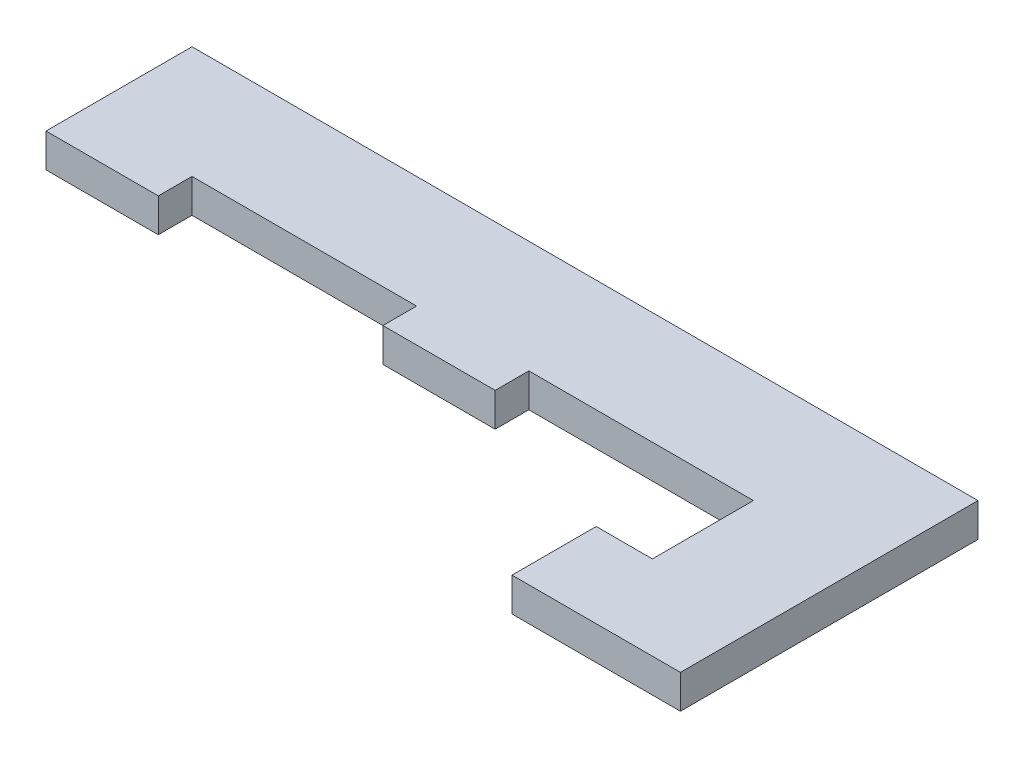
ISO-10303-21;
HEADER;
FILE_DESCRIPTION(('STEP AP214'),'2;1');
FILE_NAME('part.step','',(''),(''),'','','');
FILE_SCHEMA(('AUTOMOTIVE_DESIGN { 1 0 10303 214 1 1 1 1 }'));
ENDSEC;
DATA;
#1=APPLICATION_CONTEXT('core data for automotive mechanical design processes');
#2=APPLICATION_PROTOCOL_DEFINITION('international standard','automotive_design',2000,#1);
#3=PRODUCT_CONTEXT('',#1,'mechanical');
#4=PRODUCT('Part','Part','',(#3));
#5=PRODUCT_RELATED_PRODUCT_CATEGORY('part','',(#4));
#6=PRODUCT_DEFINITION_FORMATION('','',#4);
#7=PRODUCT_DEFINITION_CONTEXT('part definition',#1,'design');
#8=PRODUCT_DEFINITION('design','',#6,#7);
#9=PRODUCT_DEFINITION_SHAPE('','',#8);
#10=(LENGTH_UNIT() NAMED_UNIT(*) SI_UNIT(.MILLI.,.METRE.));
#11=(NAMED_UNIT(*) PLANE_ANGLE_UNIT() SI_UNIT($,.RADIAN.));
#12=(NAMED_UNIT(*) SI_UNIT($,.STERADIAN.) SOLID_ANGLE_UNIT());
#13=UNCERTAINTY_MEASURE_WITH_UNIT(LENGTH_MEASURE(1.E-05),#10,'distance_accuracy_value','');
#14=(GEOMETRIC_REPRESENTATION_CONTEXT(3) GLOBAL_UNCERTAINTY_ASSIGNED_CONTEXT((#13)) GLOBAL_UNIT_ASSIGNED_CONTEXT((#10,
#11,#12)) REPRESENTATION_CONTEXT('',''));
#15=CARTESIAN_POINT('',(0.,0.,0.));
#16=DIRECTION('',(0.,0.,1.));
#17=DIRECTION('',(1.,0.,0.));
#18=AXIS2_PLACEMENT_3D('',#15,#16,#17);
#19=CARTESIAN_POINT('',(-30.,6.,53.));
#20=DIRECTION('',(1.,0.,0.));
#21=DIRECTION('',(0.,0.,-1.));
#22=AXIS2_PLACEMENT_3D('',#19,#20,#21);
#23=PLANE('',#22);
#24=DIRECTION('',(0.,0.,1.));
#25=VECTOR('',#24,1.);
#26=CARTESIAN_POINT('',(-30.,0.,53.));
#27=LINE('',#26,#25);
#28=CARTESIAN_POINT('',(-30.,0.,38.));
#29=VERTEX_POINT('',#28);
#30=CARTESIAN_POINT('',(-30.,0.,53.));
#31=VERTEX_POINT('',#30);
#32=EDGE_CURVE('E302',#29,#31,#27,.T.);
#33=ORIENTED_EDGE('',*,*,#32,.T.);
#34=DIRECTION('',(0.,-1.,0.));
#35=VECTOR('',#34,1.);
#36=CARTESIAN_POINT('',(-30.,6.,53.));
#37=LINE('',#36,#35);
#38=CARTESIAN_POINT('',(-30.,6.,53.));
#39=VERTEX_POINT('',#38);
#40=EDGE_CURVE('E12',#39,#31,#37,.T.);
#41=ORIENTED_EDGE('',*,*,#40,.F.);
#42=DIRECTION('',(0.,0.,1.));
#43=VECTOR('',#42,1.);
#44=CARTESIAN_POINT('',(-30.,6.,53.));
#45=LINE('',#44,#43);
#46=CARTESIAN_POINT('',(-30.,6.,38.));
#47=VERTEX_POINT('',#46);
#48=EDGE_CURVE('E233',#47,#39,#45,.T.);
#49=ORIENTED_EDGE('',*,*,#48,.F.);
#50=DIRECTION('',(0.,-1.,0.));
#51=VECTOR('',#50,1.);
#52=CARTESIAN_POINT('',(-30.,6.,38.));
#53=LINE('',#52,#51);
#54=EDGE_CURVE('E179',#47,#29,#53,.T.);
#55=ORIENTED_EDGE('',*,*,#54,.T.);
#56=EDGE_LOOP('',(#33,#41,#49,#55));
#57=FACE_BOUND('',#56,.T.);
#58=ADVANCED_FACE('F46',(#57),#23,.F.);
#59=CARTESIAN_POINT('',(-30.,6.,53.));
#60=DIRECTION('',(0.,0.,-1.));
#61=DIRECTION('',(-1.,0.,0.));
#62=AXIS2_PLACEMENT_3D('',#59,#60,#61);
#63=PLANE('',#62);
#64=DIRECTION('',(1.,0.,0.));
#65=VECTOR('',#64,1.);
#66=CARTESIAN_POINT('',(-30.,0.,53.));
#67=LINE('',#66,#65);
#68=CARTESIAN_POINT('',(0.,0.,53.));
#69=VERTEX_POINT('',#68);
#70=EDGE_CURVE('E293',#31,#69,#67,.T.);
#71=ORIENTED_EDGE('',*,*,#70,.T.);
#72=DIRECTION('',(0.,-1.,0.));
#73=VECTOR('',#72,1.);
#74=CARTESIAN_POINT('',(0.,6.,53.));
#75=LINE('',#74,#73);
#76=CARTESIAN_POINT('',(0.,6.,53.));
#77=VERTEX_POINT('',#76);
#78=EDGE_CURVE('E55',#77,#69,#75,.T.);
#79=ORIENTED_EDGE('',*,*,#78,.F.);
#80=DIRECTION('',(1.,0.,0.));
#81=VECTOR('',#80,1.);
#82=CARTESIAN_POINT('',(-30.,6.,53.));
#83=LINE('',#82,#81);
#84=EDGE_CURVE('E124',#39,#77,#83,.T.);
#85=ORIENTED_EDGE('',*,*,#84,.F.);
#86=ORIENTED_EDGE('',*,*,#40,.T.);
#87=EDGE_LOOP('',(#71,#79,#85,#86));
#88=FACE_BOUND('',#87,.T.);
#89=ADVANCED_FACE('F344',(#88),#63,.F.);
#90=CARTESIAN_POINT('',(0.,6.,53.));
#91=DIRECTION('',(-1.,0.,0.));
#92=DIRECTION('',(0.,0.,1.));
#93=AXIS2_PLACEMENT_3D('',#90,#91,#92);
#94=PLANE('',#93);
#95=DIRECTION('',(0.,0.,-1.));
#96=VECTOR('',#95,1.);
#97=CARTESIAN_POINT('',(0.,0.,53.));
#98=LINE('',#97,#96);
#99=CARTESIAN_POINT('',(0.,0.,0.));
#100=VERTEX_POINT('',#99);
#101=EDGE_CURVE('E288',#69,#100,#98,.T.);
#102=ORIENTED_EDGE('',*,*,#101,.T.);
#103=DIRECTION('',(0.,-1.,0.));
#104=VECTOR('',#103,1.);
#105=CARTESIAN_POINT('',(0.,6.,0.));
#106=LINE('',#105,#104);
#107=CARTESIAN_POINT('',(0.,6.,0.));
#108=VERTEX_POINT('',#107);
#109=EDGE_CURVE('E278',#108,#100,#106,.T.);
#110=ORIENTED_EDGE('',*,*,#109,.F.);
#111=DIRECTION('',(0.,0.,-1.));
#112=VECTOR('',#111,1.);
#113=CARTESIAN_POINT('',(0.,6.,53.));
#114=LINE('',#113,#112);
#115=EDGE_CURVE('E227',#77,#108,#114,.T.);
#116=ORIENTED_EDGE('',*,*,#115,.F.);
#117=ORIENTED_EDGE('',*,*,#78,.T.);
#118=EDGE_LOOP('',(#102,#110,#116,#117));
#119=FACE_BOUND('',#118,.T.);
#120=ADVANCED_FACE('F286',(#119),#94,.F.);
#121=CARTESIAN_POINT('',(0.,6.,0.));
#122=DIRECTION('',(0.,0.,1.));
#123=DIRECTION('',(1.,0.,0.));
#124=AXIS2_PLACEMENT_3D('',#121,#122,#123);
#125=PLANE('',#124);
#126=DIRECTION('',(-1.,0.,0.));
#127=VECTOR('',#126,1.);
#128=CARTESIAN_POINT('',(0.,0.,0.));
#129=LINE('',#128,#127);
#130=CARTESIAN_POINT('',(-140.,0.,0.));
#131=VERTEX_POINT('',#130);
#132=EDGE_CURVE('E295',#100,#131,#129,.T.);
#133=ORIENTED_EDGE('',*,*,#132,.T.);
#134=DIRECTION('',(0.,-1.,0.));
#135=VECTOR('',#134,1.);
#136=CARTESIAN_POINT('',(-140.,6.,0.));
#137=LINE('',#136,#135);
#138=CARTESIAN_POINT('',(-140.,6.,0.));
#139=VERTEX_POINT('',#138);
#140=EDGE_CURVE('E274',#139,#131,#137,.T.);
#141=ORIENTED_EDGE('',*,*,#140,.F.);
#142=DIRECTION('',(-1.,0.,0.));
#143=VECTOR('',#142,1.);
#144=CARTESIAN_POINT('',(0.,6.,0.));
#145=LINE('',#144,#143);
#146=EDGE_CURVE('E219',#108,#139,#145,.T.);
#147=ORIENTED_EDGE('',*,*,#146,.F.);
#148=ORIENTED_EDGE('',*,*,#109,.T.);
#149=EDGE_LOOP('',(#133,#141,#147,#148));
#150=FACE_BOUND('',#149,.T.);
#151=ADVANCED_FACE('F351',(#150),#125,.F.);
#152=CARTESIAN_POINT('',(-140.,6.,0.));
#153=DIRECTION('',(1.,0.,0.));
#154=DIRECTION('',(0.,0.,-1.));
#155=AXIS2_PLACEMENT_3D('',#152,#153,#154);
#156=PLANE('',#155);
#157=DIRECTION('',(0.,0.,1.));
#158=VECTOR('',#157,1.);
#159=CARTESIAN_POINT('',(-140.,0.,0.));
#160=LINE('',#159,#158);
#161=CARTESIAN_POINT('',(-140.,0.,26.));
#162=VERTEX_POINT('',#161);
#163=EDGE_CURVE('E300',#131,#162,#160,.T.);
#164=ORIENTED_EDGE('',*,*,#163,.T.);
#165=DIRECTION('',(0.,-1.,0.));
#166=VECTOR('',#165,1.);
#167=CARTESIAN_POINT('',(-140.,6.,26.));
#168=LINE('',#167,#166);
#169=CARTESIAN_POINT('',(-140.,6.,26.));
#170=VERTEX_POINT('',#169);
#171=EDGE_CURVE('E270',#170,#162,#168,.T.);
#172=ORIENTED_EDGE('',*,*,#171,.F.);
#173=DIRECTION('',(0.,0.,1.));
#174=VECTOR('',#173,1.);
#175=CARTESIAN_POINT('',(-140.,6.,0.));
#176=LINE('',#175,#174);
#177=EDGE_CURVE('E215',#139,#170,#176,.T.);
#178=ORIENTED_EDGE('',*,*,#177,.F.);
#179=ORIENTED_EDGE('',*,*,#140,.T.);
#180=EDGE_LOOP('',(#164,#172,#178,#179));
#181=FACE_BOUND('',#180,.T.);
#182=ADVANCED_FACE('F356',(#181),#156,.F.);
#183=CARTESIAN_POINT('',(-140.,6.,26.));
#184=DIRECTION('',(0.,0.,-1.));
#185=DIRECTION('',(-1.,0.,0.));
#186=AXIS2_PLACEMENT_3D('',#183,#184,#185);
#187=PLANE('',#186);
#188=DIRECTION('',(1.,0.,0.));
#189=VECTOR('',#188,1.);
#190=CARTESIAN_POINT('',(-140.,0.,26.));
#191=LINE('',#190,#189);
#192=CARTESIAN_POINT('',(-120.,0.,26.));
#193=VERTEX_POINT('',#192);
#194=EDGE_CURVE('E307',#162,#193,#191,.T.);
#195=ORIENTED_EDGE('',*,*,#194,.T.);
#196=DIRECTION('',(0.,-1.,0.));
#197=VECTOR('',#196,1.);
#198=CARTESIAN_POINT('',(-120.,6.,26.));
#199=LINE('',#198,#197);
#200=CARTESIAN_POINT('',(-120.,6.,26.));
#201=VERTEX_POINT('',#200);
#202=EDGE_CURVE('E266',#201,#193,#199,.T.);
#203=ORIENTED_EDGE('',*,*,#202,.F.);
#204=DIRECTION('',(1.,0.,0.));
#205=VECTOR('',#204,1.);
#206=CARTESIAN_POINT('',(-140.,6.,26.));
#207=LINE('',#206,#205);
#208=EDGE_CURVE('E211',#170,#201,#207,.T.);
#209=ORIENTED_EDGE('',*,*,#208,.F.);
#210=ORIENTED_EDGE('',*,*,#171,.T.);
#211=EDGE_LOOP('',(#195,#203,#209,#210));
#212=FACE_BOUND('',#211,.T.);
#213=ADVANCED_FACE('F360',(#212),#187,.F.);
#214=CARTESIAN_POINT('',(-120.,6.,26.));
#215=DIRECTION('',(-1.,0.,0.));
#216=DIRECTION('',(0.,0.,1.));
#217=AXIS2_PLACEMENT_3D('',#214,#215,#216);
#218=PLANE('',#217);
#219=DIRECTION('',(0.,0.,-1.));
#220=VECTOR('',#219,1.);
#221=CARTESIAN_POINT('',(-120.,0.,26.));
#222=LINE('',#221,#220);
#223=CARTESIAN_POINT('',(-120.,0.,20.));
#224=VERTEX_POINT('',#223);
#225=EDGE_CURVE('E310',#193,#224,#222,.T.);
#226=ORIENTED_EDGE('',*,*,#225,.T.);
#227=DIRECTION('',(0.,-1.,0.));
#228=VECTOR('',#227,1.);
#229=CARTESIAN_POINT('',(-120.,6.,20.));
#230=LINE('',#229,#228);
#231=CARTESIAN_POINT('',(-120.,6.,20.));
#232=VERTEX_POINT('',#231);
#233=EDGE_CURVE('E262',#232,#224,#230,.T.);
#234=ORIENTED_EDGE('',*,*,#233,.F.);
#235=DIRECTION('',(0.,0.,-1.));
#236=VECTOR('',#235,1.);
#237=CARTESIAN_POINT('',(-120.,6.,26.));
#238=LINE('',#237,#236);
#239=EDGE_CURVE('E208',#201,#232,#238,.T.);
#240=ORIENTED_EDGE('',*,*,#239,.F.);
#241=ORIENTED_EDGE('',*,*,#202,.T.);
#242=EDGE_LOOP('',(#226,#234,#240,#241));
#243=FACE_BOUND('',#242,.T.);
#244=ADVANCED_FACE('F364',(#243),#218,.F.);
#245=CARTESIAN_POINT('',(-120.,6.,20.));
#246=DIRECTION('',(0.,0.,-1.));
#247=DIRECTION('',(-1.,0.,0.));
#248=AXIS2_PLACEMENT_3D('',#245,#246,#247);
#249=PLANE('',#248);
#250=DIRECTION('',(1.,0.,0.));
#251=VECTOR('',#250,1.);
#252=CARTESIAN_POINT('',(-120.,0.,20.));
#253=LINE('',#252,#251);
#254=CARTESIAN_POINT('',(-80.,0.,20.));
#255=VERTEX_POINT('',#254);
#256=EDGE_CURVE('E313',#224,#255,#253,.T.);
#257=ORIENTED_EDGE('',*,*,#256,.T.);
#258=DIRECTION('',(0.,-1.,0.));
#259=VECTOR('',#258,1.);
#260=CARTESIAN_POINT('',(-80.,6.,20.));
#261=LINE('',#260,#259);
#262=CARTESIAN_POINT('',(-80.,6.,20.));
#263=VERTEX_POINT('',#262);
#264=EDGE_CURVE('E258',#263,#255,#261,.T.);
#265=ORIENTED_EDGE('',*,*,#264,.F.);
#266=DIRECTION('',(1.,0.,0.));
#267=VECTOR('',#266,1.);
#268=CARTESIAN_POINT('',(-120.,6.,20.));
#269=LINE('',#268,#267);
#270=EDGE_CURVE('E200',#232,#263,#269,.T.);
#271=ORIENTED_EDGE('',*,*,#270,.F.);
#272=ORIENTED_EDGE('',*,*,#233,.T.);
#273=EDGE_LOOP('',(#257,#265,#271,#272));
#274=FACE_BOUND('',#273,.T.);
#275=ADVANCED_FACE('F368',(#274),#249,.F.);
#276=CARTESIAN_POINT('',(-80.,6.,20.));
#277=DIRECTION('',(1.,0.,0.));
#278=DIRECTION('',(0.,0.,-1.));
#279=AXIS2_PLACEMENT_3D('',#276,#277,#278);
#280=PLANE('',#279);
#281=DIRECTION('',(0.,0.,1.));
#282=VECTOR('',#281,1.);
#283=CARTESIAN_POINT('',(-80.,0.,20.));
#284=LINE('',#283,#282);
#285=CARTESIAN_POINT('',(-80.,0.,26.));
#286=VERTEX_POINT('',#285);
#287=EDGE_CURVE('E316',#255,#286,#284,.T.);
#288=ORIENTED_EDGE('',*,*,#287,.T.);
#289=DIRECTION('',(0.,-1.,0.));
#290=VECTOR('',#289,1.);
#291=CARTESIAN_POINT('',(-80.,6.,26.));
#292=LINE('',#291,#290);
#293=CARTESIAN_POINT('',(-80.,6.,26.));
#294=VERTEX_POINT('',#293);
#295=EDGE_CURVE('E254',#294,#286,#292,.T.);
#296=ORIENTED_EDGE('',*,*,#295,.F.);
#297=DIRECTION('',(0.,0.,1.));
#298=VECTOR('',#297,1.);
#299=CARTESIAN_POINT('',(-80.,6.,20.));
#300=LINE('',#299,#298);
#301=EDGE_CURVE('E196',#263,#294,#300,.T.);
#302=ORIENTED_EDGE('',*,*,#301,.F.);
#303=ORIENTED_EDGE('',*,*,#264,.T.);
#304=EDGE_LOOP('',(#288,#296,#302,#303));
#305=FACE_BOUND('',#304,.T.);
#306=ADVANCED_FACE('F372',(#305),#280,.F.);
#307=CARTESIAN_POINT('',(-80.,6.,26.));
#308=DIRECTION('',(0.,0.,-1.));
#309=DIRECTION('',(-1.,0.,0.));
#310=AXIS2_PLACEMENT_3D('',#307,#308,#309);
#311=PLANE('',#310);
#312=DIRECTION('',(1.,0.,0.));
#313=VECTOR('',#312,1.);
#314=CARTESIAN_POINT('',(-80.,0.,26.));
#315=LINE('',#314,#313);
#316=CARTESIAN_POINT('',(-60.,0.,26.));
#317=VERTEX_POINT('',#316);
#318=EDGE_CURVE('E319',#286,#317,#315,.T.);
#319=ORIENTED_EDGE('',*,*,#318,.T.);
#320=DIRECTION('',(0.,-1.,0.));
#321=VECTOR('',#320,1.);
#322=CARTESIAN_POINT('',(-60.,6.,26.));
#323=LINE('',#322,#321);
#324=CARTESIAN_POINT('',(-60.,6.,26.));
#325=VERTEX_POINT('',#324);
#326=EDGE_CURVE('E250',#325,#317,#323,.T.);
#327=ORIENTED_EDGE('',*,*,#326,.F.);
#328=DIRECTION('',(1.,0.,0.));
#329=VECTOR('',#328,1.);
#330=CARTESIAN_POINT('',(-80.,6.,26.));
#331=LINE('',#330,#329);
#332=EDGE_CURVE('E192',#294,#325,#331,.T.);
#333=ORIENTED_EDGE('',*,*,#332,.F.);
#334=ORIENTED_EDGE('',*,*,#295,.T.);
#335=EDGE_LOOP('',(#319,#327,#333,#334));
#336=FACE_BOUND('',#335,.T.);
#337=ADVANCED_FACE('F376',(#336),#311,.F.);
#338=CARTESIAN_POINT('',(-60.,6.,26.));
#339=DIRECTION('',(-1.,0.,0.));
#340=DIRECTION('',(0.,0.,1.));
#341=AXIS2_PLACEMENT_3D('',#338,#339,#340);
#342=PLANE('',#341);
#343=DIRECTION('',(0.,0.,-1.));
#344=VECTOR('',#343,1.);
#345=CARTESIAN_POINT('',(-60.,0.,26.));
#346=LINE('',#345,#344);
#347=CARTESIAN_POINT('',(-60.,0.,20.));
#348=VERTEX_POINT('',#347);
#349=EDGE_CURVE('E322',#317,#348,#346,.T.);
#350=ORIENTED_EDGE('',*,*,#349,.T.);
#351=DIRECTION('',(0.,-1.,0.));
#352=VECTOR('',#351,1.);
#353=CARTESIAN_POINT('',(-60.,6.,20.));
#354=LINE('',#353,#352);
#355=CARTESIAN_POINT('',(-60.,6.,20.));
#356=VERTEX_POINT('',#355);
#357=EDGE_CURVE('E172',#356,#348,#354,.T.);
#358=ORIENTED_EDGE('',*,*,#357,.F.);
#359=DIRECTION('',(0.,0.,-1.));
#360=VECTOR('',#359,1.);
#361=CARTESIAN_POINT('',(-60.,6.,26.));
#362=LINE('',#361,#360);
#363=EDGE_CURVE('E161',#325,#356,#362,.T.);
#364=ORIENTED_EDGE('',*,*,#363,.F.);
#365=ORIENTED_EDGE('',*,*,#326,.T.);
#366=EDGE_LOOP('',(#350,#358,#364,#365));
#367=FACE_BOUND('',#366,.T.);
#368=ADVANCED_FACE('F327',(#367),#342,.F.);
#369=CARTESIAN_POINT('',(-60.,6.,20.));
#370=DIRECTION('',(0.,0.,-1.));
#371=DIRECTION('',(-1.,0.,0.));
#372=AXIS2_PLACEMENT_3D('',#369,#370,#371);
#373=PLANE('',#372);
#374=DIRECTION('',(1.,0.,0.));
#375=VECTOR('',#374,1.);
#376=CARTESIAN_POINT('',(-60.,0.,20.));
#377=LINE('',#376,#375);
#378=CARTESIAN_POINT('',(-20.,0.,20.));
#379=VERTEX_POINT('',#378);
#380=EDGE_CURVE('E170',#348,#379,#377,.T.);
#381=ORIENTED_EDGE('',*,*,#380,.T.);
#382=DIRECTION('',(0.,-1.,0.));
#383=VECTOR('',#382,1.);
#384=CARTESIAN_POINT('',(-20.,6.,20.));
#385=LINE('',#384,#383);
#386=CARTESIAN_POINT('',(-20.,6.,20.));
#387=VERTEX_POINT('',#386);
#388=EDGE_CURVE('E167',#387,#379,#385,.T.);
#389=ORIENTED_EDGE('',*,*,#388,.F.);
#390=DIRECTION('',(1.,0.,0.));
#391=VECTOR('',#390,1.);
#392=CARTESIAN_POINT('',(-60.,6.,20.));
#393=LINE('',#392,#391);
#394=EDGE_CURVE('E155',#356,#387,#393,.T.);
#395=ORIENTED_EDGE('',*,*,#394,.F.);
#396=ORIENTED_EDGE('',*,*,#357,.T.);
#397=EDGE_LOOP('',(#381,#389,#395,#396));
#398=FACE_BOUND('',#397,.T.);
#399=ADVANCED_FACE('F168',(#398),#373,.F.);
#400=CARTESIAN_POINT('',(-20.,6.,38.));
#401=DIRECTION('',(1.,0.,0.));
#402=DIRECTION('',(0.,0.,-1.));
#403=AXIS2_PLACEMENT_3D('',#400,#401,#402);
#404=PLANE('',#403);
#405=DIRECTION('',(0.,0.,1.));
#406=VECTOR('',#405,1.);
#407=CARTESIAN_POINT('',(-20.,0.,38.));
#408=LINE('',#407,#406);
#409=CARTESIAN_POINT('',(-20.,0.,38.));
#410=VERTEX_POINT('',#409);
#411=EDGE_CURVE('E110',#379,#410,#408,.T.);
#412=ORIENTED_EDGE('',*,*,#411,.T.);
#413=DIRECTION('',(0.,-1.,0.));
#414=VECTOR('',#413,1.);
#415=CARTESIAN_POINT('',(-20.,6.,38.));
#416=LINE('',#415,#414);
#417=CARTESIAN_POINT('',(-20.,6.,38.));
#418=VERTEX_POINT('',#417);
#419=EDGE_CURVE('E173',#418,#410,#416,.T.);
#420=ORIENTED_EDGE('',*,*,#419,.F.);
#421=DIRECTION('',(0.,0.,1.));
#422=VECTOR('',#421,1.);
#423=CARTESIAN_POINT('',(-20.,6.,38.));
#424=LINE('',#423,#422);
#425=EDGE_CURVE('E159',#387,#418,#424,.T.);
#426=ORIENTED_EDGE('',*,*,#425,.F.);
#427=ORIENTED_EDGE('',*,*,#388,.T.);
#428=EDGE_LOOP('',(#412,#420,#426,#427));
#429=FACE_BOUND('',#428,.T.);
#430=ADVANCED_FACE('F175',(#429),#404,.F.);
#431=CARTESIAN_POINT('',(-30.,6.,38.));
#432=DIRECTION('',(0.,0.,1.));
#433=DIRECTION('',(1.,0.,0.));
#434=AXIS2_PLACEMENT_3D('',#431,#432,#433);
#435=PLANE('',#434);
#436=DIRECTION('',(-1.,0.,0.));
#437=VECTOR('',#436,1.);
#438=CARTESIAN_POINT('',(-30.,0.,38.));
#439=LINE('',#438,#437);
#440=EDGE_CURVE('E116',#410,#29,#439,.T.);
#441=ORIENTED_EDGE('',*,*,#440,.T.);
#442=ORIENTED_EDGE('',*,*,#54,.F.);
#443=DIRECTION('',(-1.,0.,0.));
#444=VECTOR('',#443,1.);
#445=CARTESIAN_POINT('',(-30.,6.,38.));
#446=LINE('',#445,#444);
#447=EDGE_CURVE('E63',#418,#47,#446,.T.);
#448=ORIENTED_EDGE('',*,*,#447,.F.);
#449=ORIENTED_EDGE('',*,*,#419,.T.);
#450=EDGE_LOOP('',(#441,#442,#448,#449));
#451=FACE_BOUND('',#450,.T.);
#452=ADVANCED_FACE('F333',(#451),#435,.F.);
#453=CARTESIAN_POINT('',(0.,6.,0.));
#454=DIRECTION('',(0.,-1.,0.));
#455=DIRECTION('',(0.,0.,-1.));
#456=AXIS2_PLACEMENT_3D('',#453,#454,#455);
#457=PLANE('',#456);
#458=ORIENTED_EDGE('',*,*,#48,.T.);
#459=ORIENTED_EDGE('',*,*,#84,.T.);
#460=ORIENTED_EDGE('',*,*,#115,.T.);
#461=ORIENTED_EDGE('',*,*,#146,.T.);
#462=ORIENTED_EDGE('',*,*,#177,.T.);
#463=ORIENTED_EDGE('',*,*,#208,.T.);
#464=ORIENTED_EDGE('',*,*,#239,.T.);
#465=ORIENTED_EDGE('',*,*,#270,.T.);
#466=ORIENTED_EDGE('',*,*,#301,.T.);
#467=ORIENTED_EDGE('',*,*,#332,.T.);
#468=ORIENTED_EDGE('',*,*,#363,.T.);
#469=ORIENTED_EDGE('',*,*,#394,.T.);
#470=ORIENTED_EDGE('',*,*,#425,.T.);
#471=ORIENTED_EDGE('',*,*,#447,.T.);
#472=EDGE_LOOP('',(#458,#459,#460,#461,#462,#463,#464,#465,#466,#467,#468,#469,#470,#471));
#473=FACE_BOUND('',#472,.T.);
#474=ADVANCED_FACE('F157',(#473),#457,.F.);
#475=CARTESIAN_POINT('',(0.,0.,0.));
#476=DIRECTION('',(0.,-1.,0.));
#477=DIRECTION('',(0.,0.,-1.));
#478=AXIS2_PLACEMENT_3D('',#475,#476,#477);
#479=PLANE('',#478);
#480=ORIENTED_EDGE('',*,*,#32,.F.);
#481=ORIENTED_EDGE('',*,*,#440,.F.);
#482=ORIENTED_EDGE('',*,*,#411,.F.);
#483=ORIENTED_EDGE('',*,*,#380,.F.);
#484=ORIENTED_EDGE('',*,*,#349,.F.);
#485=ORIENTED_EDGE('',*,*,#318,.F.);
#486=ORIENTED_EDGE('',*,*,#287,.F.);
#487=ORIENTED_EDGE('',*,*,#256,.F.);
#488=ORIENTED_EDGE('',*,*,#225,.F.);
#489=ORIENTED_EDGE('',*,*,#194,.F.);
#490=ORIENTED_EDGE('',*,*,#163,.F.);
#491=ORIENTED_EDGE('',*,*,#132,.F.);
#492=ORIENTED_EDGE('',*,*,#101,.F.);
#493=ORIENTED_EDGE('',*,*,#70,.F.);
#494=EDGE_LOOP('',(#480,#481,#482,#483,#484,#485,#486,#487,#488,#489,#490,#491,#492,#493));
#495=FACE_BOUND('',#494,.T.);
#496=ADVANCED_FACE('F292',(#495),#479,.T.);
#497=CLOSED_SHELL('',(#58,#89,#120,#151,#182,#213,#244,#275,#306,#337,#368,#399,#430,#452,#474,#496));
#498=MANIFOLD_SOLID_BREP('B2',#497);
#499=ADVANCED_BREP_SHAPE_REPRESENTATION('',(#18,#498),#14);
#500=SHAPE_DEFINITION_REPRESENTATION(#9,#499);
ENDSEC;
END-ISO-10303-21;
